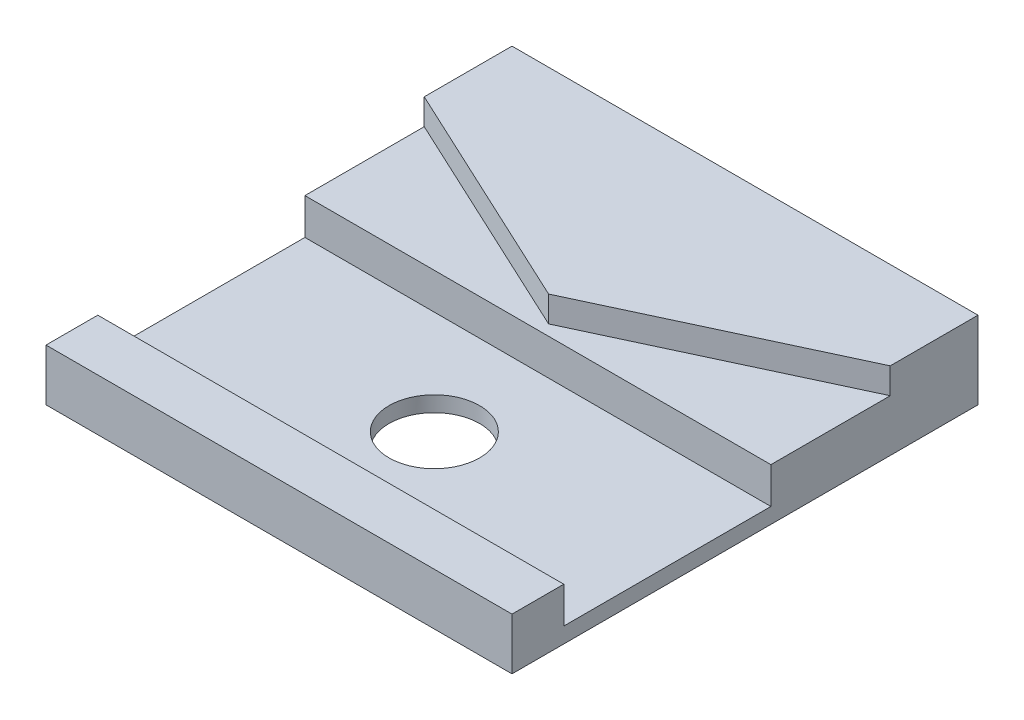
ISO-10303-21;
HEADER;
FILE_DESCRIPTION(('STEP AP214'),'2;1');
FILE_NAME('part.step','',(''),(''),'','','');
FILE_SCHEMA(('AUTOMOTIVE_DESIGN { 1 0 10303 214 1 1 1 1 }'));
ENDSEC;
DATA;
#1=APPLICATION_CONTEXT('core data for automotive mechanical design processes');
#2=APPLICATION_PROTOCOL_DEFINITION('international standard','automotive_design',2000,#1);
#3=PRODUCT_CONTEXT('',#1,'mechanical');
#4=PRODUCT('Part','Part','',(#3));
#5=PRODUCT_RELATED_PRODUCT_CATEGORY('part','',(#4));
#6=PRODUCT_DEFINITION_FORMATION('','',#4);
#7=PRODUCT_DEFINITION_CONTEXT('part definition',#1,'design');
#8=PRODUCT_DEFINITION('design','',#6,#7);
#9=PRODUCT_DEFINITION_SHAPE('','',#8);
#10=(LENGTH_UNIT() NAMED_UNIT(*) SI_UNIT(.MILLI.,.METRE.));
#11=(NAMED_UNIT(*) PLANE_ANGLE_UNIT() SI_UNIT($,.RADIAN.));
#12=(NAMED_UNIT(*) SI_UNIT($,.STERADIAN.) SOLID_ANGLE_UNIT());
#13=UNCERTAINTY_MEASURE_WITH_UNIT(LENGTH_MEASURE(1.E-05),#10,'distance_accuracy_value','');
#14=(GEOMETRIC_REPRESENTATION_CONTEXT(3) GLOBAL_UNCERTAINTY_ASSIGNED_CONTEXT((#13)) GLOBAL_UNIT_ASSIGNED_CONTEXT((#10,
#11,#12)) REPRESENTATION_CONTEXT('',''));
#15=CARTESIAN_POINT('',(0.,0.,0.));
#16=DIRECTION('',(0.,0.,1.));
#17=DIRECTION('',(1.,0.,0.));
#18=AXIS2_PLACEMENT_3D('',#15,#16,#17);
#19=CARTESIAN_POINT('',(-28.575,9.525,28.575));
#20=DIRECTION('',(-1.,0.,0.));
#21=DIRECTION('',(0.,0.,1.));
#22=AXIS2_PLACEMENT_3D('',#19,#20,#21);
#23=PLANE('',#22);
#24=DIRECTION('',(0.,-1.,0.));
#25=VECTOR('',#24,1.);
#26=CARTESIAN_POINT('',(-28.575,9.525,28.575));
#27=LINE('',#26,#25);
#28=CARTESIAN_POINT('',(-28.575,6.35,28.575));
#29=VERTEX_POINT('',#28);
#30=CARTESIAN_POINT('',(-28.575,0.,28.575));
#31=VERTEX_POINT('',#30);
#32=EDGE_CURVE('E11',#29,#31,#27,.T.);
#33=ORIENTED_EDGE('',*,*,#32,.F.);
#34=DIRECTION('',(0.,0.,1.));
#35=VECTOR('',#34,1.);
#36=CARTESIAN_POINT('',(-28.575,6.35,22.225));
#37=LINE('',#36,#35);
#38=CARTESIAN_POINT('',(-28.575,6.35,22.225));
#39=VERTEX_POINT('',#38);
#40=EDGE_CURVE('E202',#39,#29,#37,.T.);
#41=ORIENTED_EDGE('',*,*,#40,.F.);
#42=DIRECTION('',(0.,1.,0.));
#43=VECTOR('',#42,1.);
#44=CARTESIAN_POINT('',(-28.575,1.905,22.225));
#45=LINE('',#44,#43);
#46=CARTESIAN_POINT('',(-28.575,1.905,22.225));
#47=VERTEX_POINT('',#46);
#48=EDGE_CURVE('E114',#47,#39,#45,.T.);
#49=ORIENTED_EDGE('',*,*,#48,.F.);
#50=DIRECTION('',(0.,0.,1.));
#51=VECTOR('',#50,1.);
#52=CARTESIAN_POINT('',(-28.575,1.905,-3.17499999999999));
#53=LINE('',#52,#51);
#54=CARTESIAN_POINT('',(-28.575,1.905,-3.17499999999999));
#55=VERTEX_POINT('',#54);
#56=EDGE_CURVE('E148',#55,#47,#53,.T.);
#57=ORIENTED_EDGE('',*,*,#56,.F.);
#58=DIRECTION('',(0.,1.,0.));
#59=VECTOR('',#58,1.);
#60=CARTESIAN_POINT('',(-28.575,1.905,-3.17499999999999));
#61=LINE('',#60,#59);
#62=CARTESIAN_POINT('',(-28.575,6.35,-3.175));
#63=VERTEX_POINT('',#62);
#64=EDGE_CURVE('E137',#55,#63,#61,.T.);
#65=ORIENTED_EDGE('',*,*,#64,.T.);
#66=DIRECTION('',(0.,0.,-1.));
#67=VECTOR('',#66,1.);
#68=CARTESIAN_POINT('',(-28.575,6.35,-17.8126409026028));
#69=LINE('',#68,#67);
#70=CARTESIAN_POINT('',(-28.575,6.35,-17.8126409026028));
#71=VERTEX_POINT('',#70);
#72=EDGE_CURVE('E196',#63,#71,#69,.T.);
#73=ORIENTED_EDGE('',*,*,#72,.T.);
#74=DIRECTION('',(0.,1.,0.));
#75=VECTOR('',#74,1.);
#76=CARTESIAN_POINT('',(-28.575,6.35,-17.8126409026028));
#77=LINE('',#76,#75);
#78=CARTESIAN_POINT('',(-28.575,9.525,-17.8126409026028));
#79=VERTEX_POINT('',#78);
#80=EDGE_CURVE('E182',#71,#79,#77,.T.);
#81=ORIENTED_EDGE('',*,*,#80,.T.);
#82=DIRECTION('',(0.,0.,-1.));
#83=VECTOR('',#82,1.);
#84=CARTESIAN_POINT('',(-28.575,9.525,28.575));
#85=LINE('',#84,#83);
#86=CARTESIAN_POINT('',(-28.575,9.525,-28.575));
#87=VERTEX_POINT('',#86);
#88=EDGE_CURVE('E102',#79,#87,#85,.T.);
#89=ORIENTED_EDGE('',*,*,#88,.T.);
#90=DIRECTION('',(0.,-1.,0.));
#91=VECTOR('',#90,1.);
#92=CARTESIAN_POINT('',(-28.575,9.525,-28.575));
#93=LINE('',#92,#91);
#94=CARTESIAN_POINT('',(-28.575,0.,-28.575));
#95=VERTEX_POINT('',#94);
#96=EDGE_CURVE('E41',#87,#95,#93,.T.);
#97=ORIENTED_EDGE('',*,*,#96,.T.);
#98=DIRECTION('',(0.,0.,-1.));
#99=VECTOR('',#98,1.);
#100=CARTESIAN_POINT('',(-28.575,0.,28.575));
#101=LINE('',#100,#99);
#102=EDGE_CURVE('E98',#31,#95,#101,.T.);
#103=ORIENTED_EDGE('',*,*,#102,.F.);
#104=EDGE_LOOP('',(#33,#41,#49,#57,#65,#73,#81,#89,#97,#103));
#105=FACE_BOUND('',#104,.T.);
#106=ADVANCED_FACE('F38',(#105),#23,.T.);
#107=CARTESIAN_POINT('',(-28.575,9.525,28.575));
#108=DIRECTION('',(0.,0.,-1.));
#109=DIRECTION('',(-1.,0.,0.));
#110=AXIS2_PLACEMENT_3D('',#107,#108,#109);
#111=PLANE('',#110);
#112=DIRECTION('',(1.,0.,0.));
#113=VECTOR('',#112,1.);
#114=CARTESIAN_POINT('',(-28.575,6.35,28.575));
#115=LINE('',#114,#113);
#116=CARTESIAN_POINT('',(28.575,6.35,28.575));
#117=VERTEX_POINT('',#116);
#118=EDGE_CURVE('E90',#29,#117,#115,.T.);
#119=ORIENTED_EDGE('',*,*,#118,.F.);
#120=ORIENTED_EDGE('',*,*,#32,.T.);
#121=DIRECTION('',(1.,0.,0.));
#122=VECTOR('',#121,1.);
#123=CARTESIAN_POINT('',(-28.575,0.,28.575));
#124=LINE('',#123,#122);
#125=CARTESIAN_POINT('',(28.575,0.,28.575));
#126=VERTEX_POINT('',#125);
#127=EDGE_CURVE('E87',#31,#126,#124,.T.);
#128=ORIENTED_EDGE('',*,*,#127,.T.);
#129=DIRECTION('',(0.,-1.,0.));
#130=VECTOR('',#129,1.);
#131=CARTESIAN_POINT('',(28.575,9.525,28.575));
#132=LINE('',#131,#130);
#133=EDGE_CURVE('E47',#117,#126,#132,.T.);
#134=ORIENTED_EDGE('',*,*,#133,.F.);
#135=EDGE_LOOP('',(#119,#120,#128,#134));
#136=FACE_BOUND('',#135,.T.);
#137=ADVANCED_FACE('F85',(#136),#111,.F.);
#138=CARTESIAN_POINT('',(28.575,9.525,28.575));
#139=DIRECTION('',(-1.,0.,0.));
#140=DIRECTION('',(0.,0.,1.));
#141=AXIS2_PLACEMENT_3D('',#138,#139,#140);
#142=PLANE('',#141);
#143=DIRECTION('',(0.,0.,-1.));
#144=VECTOR('',#143,1.);
#145=CARTESIAN_POINT('',(28.575,6.35,28.575));
#146=LINE('',#145,#144);
#147=CARTESIAN_POINT('',(28.575,6.35,22.225));
#148=VERTEX_POINT('',#147);
#149=EDGE_CURVE('E55',#117,#148,#146,.T.);
#150=ORIENTED_EDGE('',*,*,#149,.F.);
#151=ORIENTED_EDGE('',*,*,#133,.T.);
#152=DIRECTION('',(0.,0.,-1.));
#153=VECTOR('',#152,1.);
#154=CARTESIAN_POINT('',(28.575,0.,28.575));
#155=LINE('',#154,#153);
#156=CARTESIAN_POINT('',(28.575,0.,-28.575));
#157=VERTEX_POINT('',#156);
#158=EDGE_CURVE('E100',#126,#157,#155,.T.);
#159=ORIENTED_EDGE('',*,*,#158,.T.);
#160=DIRECTION('',(0.,-1.,0.));
#161=VECTOR('',#160,1.);
#162=CARTESIAN_POINT('',(28.575,9.525,-28.575));
#163=LINE('',#162,#161);
#164=CARTESIAN_POINT('',(28.575,9.525,-28.575));
#165=VERTEX_POINT('',#164);
#166=EDGE_CURVE('E122',#165,#157,#163,.T.);
#167=ORIENTED_EDGE('',*,*,#166,.F.);
#168=DIRECTION('',(0.,0.,-1.));
#169=VECTOR('',#168,1.);
#170=CARTESIAN_POINT('',(28.575,9.525,28.575));
#171=LINE('',#170,#169);
#172=CARTESIAN_POINT('',(28.575,9.525,-17.8126409026028));
#173=VERTEX_POINT('',#172);
#174=EDGE_CURVE('E64',#173,#165,#171,.T.);
#175=ORIENTED_EDGE('',*,*,#174,.F.);
#176=DIRECTION('',(0.,1.,0.));
#177=VECTOR('',#176,1.);
#178=CARTESIAN_POINT('',(28.575,6.35,-17.8126409026028));
#179=LINE('',#178,#177);
#180=CARTESIAN_POINT('',(28.575,6.35,-17.8126409026028));
#181=VERTEX_POINT('',#180);
#182=EDGE_CURVE('E169',#181,#173,#179,.T.);
#183=ORIENTED_EDGE('',*,*,#182,.F.);
#184=DIRECTION('',(0.,0.,-1.));
#185=VECTOR('',#184,1.);
#186=CARTESIAN_POINT('',(28.575,6.35,-17.8126409026028));
#187=LINE('',#186,#185);
#188=CARTESIAN_POINT('',(28.575,6.35,-3.175));
#189=VERTEX_POINT('',#188);
#190=EDGE_CURVE('E186',#189,#181,#187,.T.);
#191=ORIENTED_EDGE('',*,*,#190,.F.);
#192=DIRECTION('',(0.,1.,0.));
#193=VECTOR('',#192,1.);
#194=CARTESIAN_POINT('',(28.575,1.905,-3.175));
#195=LINE('',#194,#193);
#196=CARTESIAN_POINT('',(28.575,1.905,-3.175));
#197=VERTEX_POINT('',#196);
#198=EDGE_CURVE('E133',#197,#189,#195,.T.);
#199=ORIENTED_EDGE('',*,*,#198,.F.);
#200=DIRECTION('',(0.,0.,-1.));
#201=VECTOR('',#200,1.);
#202=CARTESIAN_POINT('',(28.575,1.905,-3.175));
#203=LINE('',#202,#201);
#204=CARTESIAN_POINT('',(28.575,1.905,22.225));
#205=VERTEX_POINT('',#204);
#206=EDGE_CURVE('E156',#205,#197,#203,.T.);
#207=ORIENTED_EDGE('',*,*,#206,.F.);
#208=DIRECTION('',(0.,1.,0.));
#209=VECTOR('',#208,1.);
#210=CARTESIAN_POINT('',(28.575,1.905,22.225));
#211=LINE('',#210,#209);
#212=EDGE_CURVE('E108',#205,#148,#211,.T.);
#213=ORIENTED_EDGE('',*,*,#212,.T.);
#214=EDGE_LOOP('',(#150,#151,#159,#167,#175,#183,#191,#199,#207,#213));
#215=FACE_BOUND('',#214,.T.);
#216=ADVANCED_FACE('F223',(#215),#142,.F.);
#217=CARTESIAN_POINT('',(28.575,1.905,22.225));
#218=DIRECTION('',(0.,0.,1.));
#219=DIRECTION('',(1.,0.,0.));
#220=AXIS2_PLACEMENT_3D('',#217,#218,#219);
#221=PLANE('',#220);
#222=DIRECTION('',(-1.,0.,0.));
#223=VECTOR('',#222,1.);
#224=CARTESIAN_POINT('',(28.575,6.35,22.225));
#225=LINE('',#224,#223);
#226=EDGE_CURVE('E212',#148,#39,#225,.T.);
#227=ORIENTED_EDGE('',*,*,#226,.F.);
#228=ORIENTED_EDGE('',*,*,#212,.F.);
#229=DIRECTION('',(1.,0.,0.));
#230=VECTOR('',#229,1.);
#231=CARTESIAN_POINT('',(28.575,1.905,22.225));
#232=LINE('',#231,#230);
#233=EDGE_CURVE('E138',#47,#205,#232,.T.);
#234=ORIENTED_EDGE('',*,*,#233,.F.);
#235=ORIENTED_EDGE('',*,*,#48,.T.);
#236=EDGE_LOOP('',(#227,#228,#234,#235));
#237=FACE_BOUND('',#236,.T.);
#238=ADVANCED_FACE('F229',(#237),#221,.F.);
#239=CARTESIAN_POINT('',(0.,9.525,0.));
#240=DIRECTION('',(0.,-1.,0.));
#241=DIRECTION('',(0.,0.,-1.));
#242=AXIS2_PLACEMENT_3D('',#239,#240,#241);
#243=PLANE('',#242);
#244=DIRECTION('',(0.906307787036649,0.,0.422618261740701));
#245=VECTOR('',#244,1.);
#246=CARTESIAN_POINT('',(0.,9.525,-4.48789957082366));
#247=LINE('',#246,#245);
#248=CARTESIAN_POINT('',(0.,9.525,-4.48789957082366));
#249=VERTEX_POINT('',#248);
#250=EDGE_CURVE('E197',#79,#249,#247,.T.);
#251=ORIENTED_EDGE('',*,*,#250,.T.);
#252=DIRECTION('',(-0.906307787036649,0.,0.422618261740701));
#253=VECTOR('',#252,1.);
#254=CARTESIAN_POINT('',(0.,9.525,-4.48789957082366));
#255=LINE('',#254,#253);
#256=EDGE_CURVE('E177',#173,#249,#255,.T.);
#257=ORIENTED_EDGE('',*,*,#256,.F.);
#258=ORIENTED_EDGE('',*,*,#174,.T.);
#259=DIRECTION('',(1.,0.,0.));
#260=VECTOR('',#259,1.);
#261=CARTESIAN_POINT('',(-28.575,9.525,-28.575));
#262=LINE('',#261,#260);
#263=EDGE_CURVE('E128',#87,#165,#262,.T.);
#264=ORIENTED_EDGE('',*,*,#263,.F.);
#265=ORIENTED_EDGE('',*,*,#88,.F.);
#266=EDGE_LOOP('',(#251,#257,#258,#264,#265));
#267=FACE_BOUND('',#266,.T.);
#268=ADVANCED_FACE('F278',(#267),#243,.F.);
#269=CARTESIAN_POINT('',(28.575,1.905,-3.175));
#270=DIRECTION('',(0.,0.,-1.));
#271=DIRECTION('',(-1.,0.,0.));
#272=AXIS2_PLACEMENT_3D('',#269,#270,#271);
#273=PLANE('',#272);
#274=DIRECTION('',(1.,0.,0.));
#275=VECTOR('',#274,1.);
#276=CARTESIAN_POINT('',(28.575,6.35,-3.175));
#277=LINE('',#276,#275);
#278=EDGE_CURVE('E181',#63,#189,#277,.T.);
#279=ORIENTED_EDGE('',*,*,#278,.F.);
#280=ORIENTED_EDGE('',*,*,#64,.F.);
#281=DIRECTION('',(-1.,0.,0.));
#282=VECTOR('',#281,1.);
#283=CARTESIAN_POINT('',(28.575,1.905,-3.175));
#284=LINE('',#283,#282);
#285=EDGE_CURVE('E152',#197,#55,#284,.T.);
#286=ORIENTED_EDGE('',*,*,#285,.F.);
#287=ORIENTED_EDGE('',*,*,#198,.T.);
#288=EDGE_LOOP('',(#279,#280,#286,#287));
#289=FACE_BOUND('',#288,.T.);
#290=ADVANCED_FACE('F276',(#289),#273,.F.);
#291=CARTESIAN_POINT('',(-28.575,9.525,-28.575));
#292=DIRECTION('',(0.,0.,-1.));
#293=DIRECTION('',(-1.,0.,0.));
#294=AXIS2_PLACEMENT_3D('',#291,#292,#293);
#295=PLANE('',#294);
#296=DIRECTION('',(1.,0.,0.));
#297=VECTOR('',#296,1.);
#298=CARTESIAN_POINT('',(-28.575,0.,-28.575));
#299=LINE('',#298,#297);
#300=EDGE_CURVE('E107',#95,#157,#299,.T.);
#301=ORIENTED_EDGE('',*,*,#300,.F.);
#302=ORIENTED_EDGE('',*,*,#96,.F.);
#303=ORIENTED_EDGE('',*,*,#263,.T.);
#304=ORIENTED_EDGE('',*,*,#166,.T.);
#305=EDGE_LOOP('',(#301,#302,#303,#304));
#306=FACE_BOUND('',#305,.T.);
#307=ADVANCED_FACE('F279',(#306),#295,.T.);
#308=CARTESIAN_POINT('',(0.,0.,0.));
#309=DIRECTION('',(0.,-1.,0.));
#310=DIRECTION('',(0.,0.,-1.));
#311=AXIS2_PLACEMENT_3D('',#308,#309,#310);
#312=PLANE('',#311);
#313=CARTESIAN_POINT('',(0.,0.,9.525));
#314=DIRECTION('',(0.,-1.,0.));
#315=DIRECTION('',(0.,0.,-1.));
#316=AXIS2_PLACEMENT_3D('',#313,#314,#315);
#317=CIRCLE('',#316,5.55625);
#318=CARTESIAN_POINT('',(0.,0.,3.96875));
#319=VERTEX_POINT('',#318);
#320=EDGE_CURVE('E160',#319,#319,#317,.T.);
#321=ORIENTED_EDGE('',*,*,#320,.F.);
#322=EDGE_LOOP('',(#321));
#323=FACE_BOUND('',#322,.T.);
#324=ORIENTED_EDGE('',*,*,#102,.T.);
#325=ORIENTED_EDGE('',*,*,#300,.T.);
#326=ORIENTED_EDGE('',*,*,#158,.F.);
#327=ORIENTED_EDGE('',*,*,#127,.F.);
#328=EDGE_LOOP('',(#324,#325,#326,#327));
#329=FACE_BOUND('',#328,.T.);
#330=ADVANCED_FACE('F96',(#323,#329),#312,.T.);
#331=CARTESIAN_POINT('',(0.,1.905,0.));
#332=DIRECTION('',(0.,-1.,0.));
#333=DIRECTION('',(0.,0.,-1.));
#334=AXIS2_PLACEMENT_3D('',#331,#332,#333);
#335=PLANE('',#334);
#336=CARTESIAN_POINT('',(0.,1.905,9.525));
#337=DIRECTION('',(0.,1.,0.));
#338=DIRECTION('',(0.,0.,1.));
#339=AXIS2_PLACEMENT_3D('',#336,#337,#338);
#340=CIRCLE('',#339,5.55625);
#341=CARTESIAN_POINT('',(0.,1.905,15.08125));
#342=VERTEX_POINT('',#341);
#343=EDGE_CURVE('E164',#342,#342,#340,.T.);
#344=ORIENTED_EDGE('',*,*,#343,.F.);
#345=EDGE_LOOP('',(#344));
#346=FACE_BOUND('',#345,.T.);
#347=ORIENTED_EDGE('',*,*,#206,.T.);
#348=ORIENTED_EDGE('',*,*,#285,.T.);
#349=ORIENTED_EDGE('',*,*,#56,.T.);
#350=ORIENTED_EDGE('',*,*,#233,.T.);
#351=EDGE_LOOP('',(#347,#348,#349,#350));
#352=FACE_BOUND('',#351,.T.);
#353=ADVANCED_FACE('F233',(#346,#352),#335,.F.);
#354=CARTESIAN_POINT('',(0.,1.905,9.525));
#355=DIRECTION('',(0.,1.,0.));
#356=DIRECTION('',(0.,0.,1.));
#357=AXIS2_PLACEMENT_3D('',#354,#355,#356);
#358=CYLINDRICAL_SURFACE('',#357,5.55625);
#359=ORIENTED_EDGE('',*,*,#320,.T.);
#360=EDGE_LOOP('',(#359));
#361=FACE_BOUND('',#360,.T.);
#362=ORIENTED_EDGE('',*,*,#343,.T.);
#363=EDGE_LOOP('',(#362));
#364=FACE_BOUND('',#363,.T.);
#365=ADVANCED_FACE('F306',(#361,#364),#358,.F.);
#366=CARTESIAN_POINT('',(0.,6.35,-4.48789957082366));
#367=DIRECTION('',(-0.422618261740701,0.,-0.906307787036649));
#368=DIRECTION('',(-0.906307787036649,0.,0.422618261740701));
#369=AXIS2_PLACEMENT_3D('',#366,#367,#368);
#370=PLANE('',#369);
#371=ORIENTED_EDGE('',*,*,#256,.T.);
#372=DIRECTION('',(0.,1.,0.));
#373=VECTOR('',#372,1.);
#374=CARTESIAN_POINT('',(0.,6.35,-4.48789957082366));
#375=LINE('',#374,#373);
#376=CARTESIAN_POINT('',(0.,6.35,-4.48789957082366));
#377=VERTEX_POINT('',#376);
#378=EDGE_CURVE('E168',#377,#249,#375,.T.);
#379=ORIENTED_EDGE('',*,*,#378,.F.);
#380=DIRECTION('',(-0.906307787036649,0.,0.422618261740701));
#381=VECTOR('',#380,1.);
#382=CARTESIAN_POINT('',(0.,6.35,-4.48789957082366));
#383=LINE('',#382,#381);
#384=EDGE_CURVE('E173',#181,#377,#383,.T.);
#385=ORIENTED_EDGE('',*,*,#384,.F.);
#386=ORIENTED_EDGE('',*,*,#182,.T.);
#387=EDGE_LOOP('',(#371,#379,#385,#386));
#388=FACE_BOUND('',#387,.T.);
#389=ADVANCED_FACE('F272',(#388),#370,.F.);
#390=CARTESIAN_POINT('',(0.,6.35,0.));
#391=DIRECTION('',(0.,1.,0.));
#392=DIRECTION('',(0.,0.,1.));
#393=AXIS2_PLACEMENT_3D('',#390,#391,#392);
#394=PLANE('',#393);
#395=ORIENTED_EDGE('',*,*,#384,.T.);
#396=DIRECTION('',(0.906307787036649,0.,0.422618261740701));
#397=VECTOR('',#396,1.);
#398=CARTESIAN_POINT('',(0.,6.35,-4.48789957082366));
#399=LINE('',#398,#397);
#400=EDGE_CURVE('E201',#71,#377,#399,.T.);
#401=ORIENTED_EDGE('',*,*,#400,.F.);
#402=ORIENTED_EDGE('',*,*,#72,.F.);
#403=ORIENTED_EDGE('',*,*,#278,.T.);
#404=ORIENTED_EDGE('',*,*,#190,.T.);
#405=EDGE_LOOP('',(#395,#401,#402,#403,#404));
#406=FACE_BOUND('',#405,.T.);
#407=ADVANCED_FACE('F274',(#406),#394,.T.);
#408=CARTESIAN_POINT('',(0.,6.35,-4.48789957082366));
#409=DIRECTION('',(-0.422618261740701,0.,0.906307787036649));
#410=DIRECTION('',(0.906307787036649,0.,0.422618261740701));
#411=AXIS2_PLACEMENT_3D('',#408,#409,#410);
#412=PLANE('',#411);
#413=ORIENTED_EDGE('',*,*,#250,.F.);
#414=ORIENTED_EDGE('',*,*,#80,.F.);
#415=ORIENTED_EDGE('',*,*,#400,.T.);
#416=ORIENTED_EDGE('',*,*,#378,.T.);
#417=EDGE_LOOP('',(#413,#414,#415,#416));
#418=FACE_BOUND('',#417,.T.);
#419=ADVANCED_FACE('F267',(#418),#412,.T.);
#420=CARTESIAN_POINT('',(0.,6.35,0.));
#421=DIRECTION('',(0.,1.,0.));
#422=DIRECTION('',(0.,0.,1.));
#423=AXIS2_PLACEMENT_3D('',#420,#421,#422);
#424=PLANE('',#423);
#425=ORIENTED_EDGE('',*,*,#118,.T.);
#426=ORIENTED_EDGE('',*,*,#149,.T.);
#427=ORIENTED_EDGE('',*,*,#226,.T.);
#428=ORIENTED_EDGE('',*,*,#40,.T.);
#429=EDGE_LOOP('',(#425,#426,#427,#428));
#430=FACE_BOUND('',#429,.T.);
#431=ADVANCED_FACE('F219',(#430),#424,.T.);
#432=CLOSED_SHELL('',(#106,#137,#216,#238,#268,#290,#307,#330,#353,#365,#389,#407,#419,#431));
#433=MANIFOLD_SOLID_BREP('B2',#432);
#434=ADVANCED_BREP_SHAPE_REPRESENTATION('',(#18,#433),#14);
#435=SHAPE_DEFINITION_REPRESENTATION(#9,#434);
ENDSEC;
END-ISO-10303-21;
